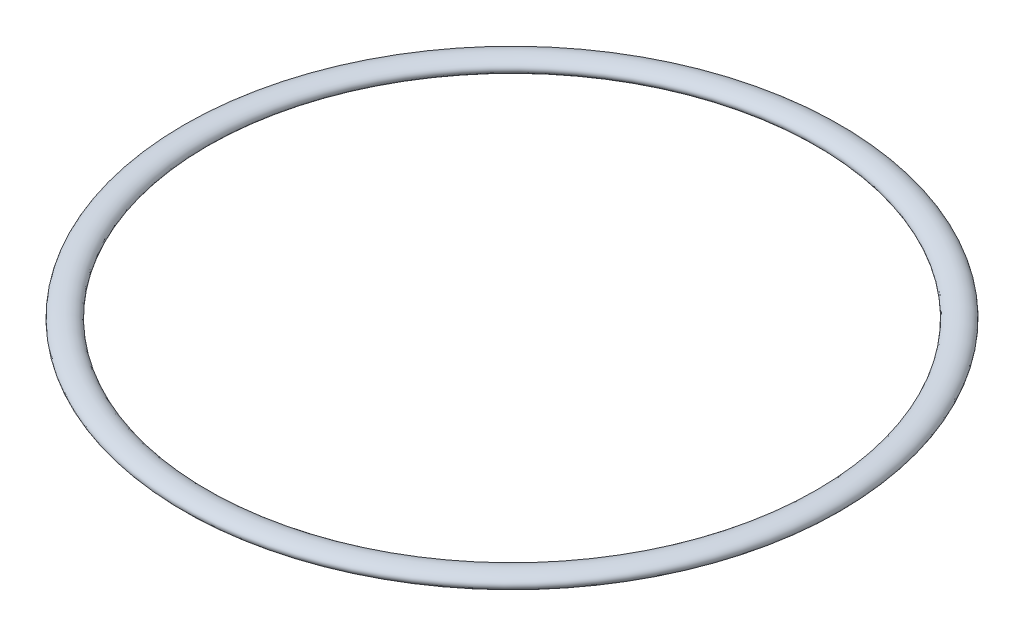
ISO-10303-21;
HEADER;
FILE_DESCRIPTION(('STEP AP214'),'2;1');
FILE_NAME('part.step','',(''),(''),'','','');
FILE_SCHEMA(('AUTOMOTIVE_DESIGN { 1 0 10303 214 1 1 1 1 }'));
ENDSEC;
DATA;
#1=APPLICATION_CONTEXT('core data for automotive mechanical design processes');
#2=APPLICATION_PROTOCOL_DEFINITION('international standard','automotive_design',2000,#1);
#3=PRODUCT_CONTEXT('',#1,'mechanical');
#4=PRODUCT('Part','Part','',(#3));
#5=PRODUCT_RELATED_PRODUCT_CATEGORY('part','',(#4));
#6=PRODUCT_DEFINITION_FORMATION('','',#4);
#7=PRODUCT_DEFINITION_CONTEXT('part definition',#1,'design');
#8=PRODUCT_DEFINITION('design','',#6,#7);
#9=PRODUCT_DEFINITION_SHAPE('','',#8);
#10=(LENGTH_UNIT() NAMED_UNIT(*) SI_UNIT(.MILLI.,.METRE.));
#11=(NAMED_UNIT(*) PLANE_ANGLE_UNIT() SI_UNIT($,.RADIAN.));
#12=(NAMED_UNIT(*) SI_UNIT($,.STERADIAN.) SOLID_ANGLE_UNIT());
#13=UNCERTAINTY_MEASURE_WITH_UNIT(LENGTH_MEASURE(1.E-05),#10,'distance_accuracy_value','');
#14=(GEOMETRIC_REPRESENTATION_CONTEXT(3) GLOBAL_UNCERTAINTY_ASSIGNED_CONTEXT((#13)) GLOBAL_UNIT_ASSIGNED_CONTEXT((#10,
#11,#12)) REPRESENTATION_CONTEXT('',''));
#15=CARTESIAN_POINT('',(0.,0.,0.));
#16=DIRECTION('',(0.,0.,1.));
#17=DIRECTION('',(1.,0.,0.));
#18=AXIS2_PLACEMENT_3D('',#15,#16,#17);
#19=CARTESIAN_POINT('',(32.425,0.,0.));
#20=DIRECTION('',(0.,0.,1.));
#21=DIRECTION('',(1.,0.,0.));
#22=AXIS2_PLACEMENT_3D('',#19,#20,#21);
#23=ELLIPSE('',#22,1.3612314891128,0.725);
#24=CARTESIAN_POINT('',(0.,-500.,0.));
#25=DIRECTION('',(0.,-1.,0.));
#26=AXIS1_PLACEMENT('',#24,#25);
#27=SURFACE_OF_REVOLUTION('',#23,#26);
#28=ADVANCED_FACE('F34',(),#27,.F.);
#29=CLOSED_SHELL('',(#28));
#30=MANIFOLD_SOLID_BREP('B2',#29);
#31=ADVANCED_BREP_SHAPE_REPRESENTATION('',(#18,#30),#14);
#32=SHAPE_DEFINITION_REPRESENTATION(#9,#31);
ENDSEC;
END-ISO-10303-21;
